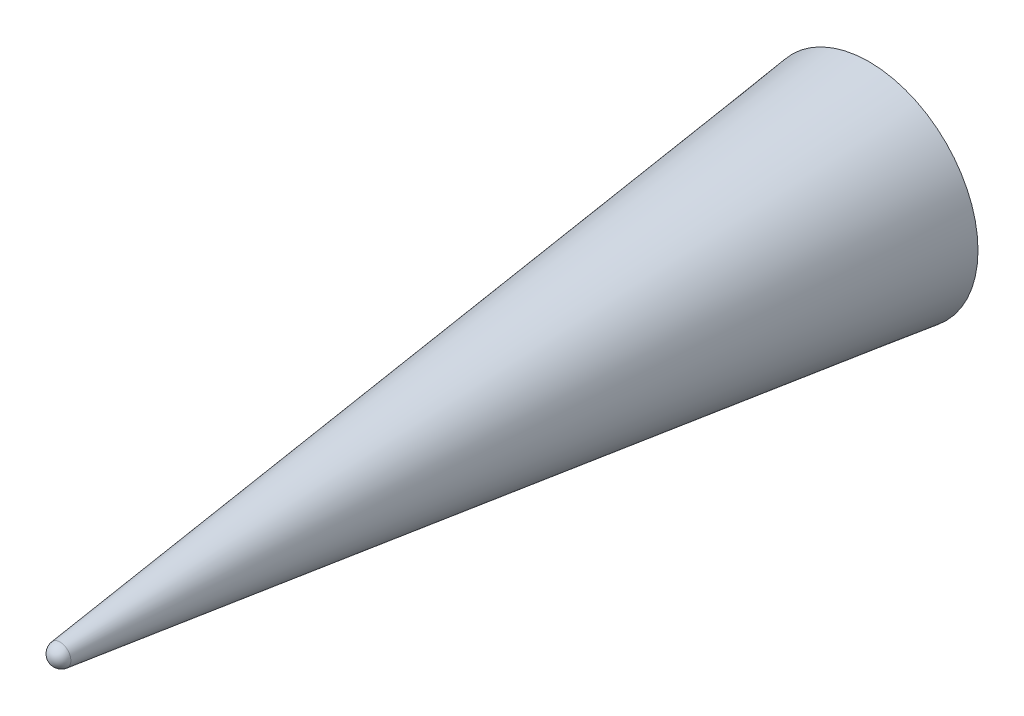
ISO-10303-21;
HEADER;
FILE_DESCRIPTION(('STEP AP214'),'2;1');
FILE_NAME('part.step','',(''),(''),'','','');
FILE_SCHEMA(('AUTOMOTIVE_DESIGN { 1 0 10303 214 1 1 1 1 }'));
ENDSEC;
DATA;
#1=APPLICATION_CONTEXT('core data for automotive mechanical design processes');
#2=APPLICATION_PROTOCOL_DEFINITION('international standard','automotive_design',2000,#1);
#3=PRODUCT_CONTEXT('',#1,'mechanical');
#4=PRODUCT('Part','Part','',(#3));
#5=PRODUCT_RELATED_PRODUCT_CATEGORY('part','',(#4));
#6=PRODUCT_DEFINITION_FORMATION('','',#4);
#7=PRODUCT_DEFINITION_CONTEXT('part definition',#1,'design');
#8=PRODUCT_DEFINITION('design','',#6,#7);
#9=PRODUCT_DEFINITION_SHAPE('','',#8);
#10=(LENGTH_UNIT() NAMED_UNIT(*) SI_UNIT(.MILLI.,.METRE.));
#11=(NAMED_UNIT(*) PLANE_ANGLE_UNIT() SI_UNIT($,.RADIAN.));
#12=(NAMED_UNIT(*) SI_UNIT($,.STERADIAN.) SOLID_ANGLE_UNIT());
#13=UNCERTAINTY_MEASURE_WITH_UNIT(LENGTH_MEASURE(1.E-05),#10,'distance_accuracy_value','');
#14=(GEOMETRIC_REPRESENTATION_CONTEXT(3) GLOBAL_UNCERTAINTY_ASSIGNED_CONTEXT((#13)) GLOBAL_UNIT_ASSIGNED_CONTEXT((#10,
#11,#12)) REPRESENTATION_CONTEXT('',''));
#15=CARTESIAN_POINT('',(0.,0.,0.));
#16=DIRECTION('',(0.,0.,1.));
#17=DIRECTION('',(1.,0.,0.));
#18=AXIS2_PLACEMENT_3D('',#15,#16,#17);
#19=CARTESIAN_POINT('',(0.,0.,0.));
#20=DIRECTION('',(0.,0.,-1.));
#21=DIRECTION('',(-1.,0.,0.));
#22=AXIS2_PLACEMENT_3D('',#19,#20,#21);
#23=CONICAL_SURFACE('',#22,50.8,0.120623668580103);
#24=CARTESIAN_POINT('',(0.,0.,377.494527194967));
#25=DIRECTION('',(0.,0.,1.));
#26=DIRECTION('',(1.,0.,0.));
#27=AXIS2_PLACEMENT_3D('',#24,#25,#26);
#28=CIRCLE('',#27,5.04308761273125);
#29=CARTESIAN_POINT('',(-5.04308761273125,0.,377.494527194967));
#30=VERTEX_POINT('',#29);
#31=EDGE_CURVE('E10',#30,#30,#28,.T.);
#32=CARTESIAN_POINT('',(0.,0.,0.));
#33=DIRECTION('',(0.,0.,1.));
#34=DIRECTION('',(1.,0.,0.));
#35=AXIS2_PLACEMENT_3D('',#32,#33,#34);
#36=CIRCLE('',#35,50.8);
#37=CARTESIAN_POINT('',(-50.8,0.,0.));
#38=VERTEX_POINT('',#37);
#39=EDGE_CURVE('E44',#38,#38,#36,.T.);
#40=CARTESIAN_POINT('',(-5.04308761273125,0.,377.494527194967));
#41=CARTESIAN_POINT('',(-5.5197221167653,0.,373.562292536686));
#42=CARTESIAN_POINT('',(-5.99635662079935,0.,369.630057878405));
#43=CARTESIAN_POINT('',(-6.94962562886745,0.,361.765588561844));
#44=CARTESIAN_POINT('',(-7.4262601329015,0.,357.833353903563));
#45=CARTESIAN_POINT('',(-8.37952914096959,0.,349.968884587001));
#46=CARTESIAN_POINT('',(-8.85616364500365,0.,346.03664992872));
#47=CARTESIAN_POINT('',(-9.80943265307174,0.,338.172180612158));
#48=CARTESIAN_POINT('',(-10.2860671571058,0.,334.239945953877));
#49=CARTESIAN_POINT('',(-11.2393361651739,0.,326.375476637315));
#50=CARTESIAN_POINT('',(-11.7159706692079,0.,322.443241979034));
#51=CARTESIAN_POINT('',(-12.669239677276,0.,314.578772662473));
#52=CARTESIAN_POINT('',(-13.1458741813101,0.,310.646538004192));
#53=CARTESIAN_POINT('',(-14.0991431893782,0.,302.78206868763));
#54=CARTESIAN_POINT('',(-14.5757776934122,0.,298.849834029349));
#55=CARTESIAN_POINT('',(-15.5290467014803,0.,290.985364712787));
#56=CARTESIAN_POINT('',(-16.0056812055144,0.,287.053130054506));
#57=CARTESIAN_POINT('',(-16.9589502135825,0.,279.188660737944));
#58=CARTESIAN_POINT('',(-17.4355847176165,0.,275.256426079664));
#59=CARTESIAN_POINT('',(-18.3888537256846,0.,267.391956763102));
#60=CARTESIAN_POINT('',(-18.8654882297187,0.,263.459722104821));
#61=CARTESIAN_POINT('',(-19.8187572377868,0.,255.595252788259));
#62=CARTESIAN_POINT('',(-20.2953917418208,0.,251.663018129978));
#63=CARTESIAN_POINT('',(-21.2486607498889,0.,243.798548813416));
#64=CARTESIAN_POINT('',(-21.725295253923,0.,239.866314155135));
#65=CARTESIAN_POINT('',(-22.6785642619911,0.,232.001844838574));
#66=CARTESIAN_POINT('',(-23.1551987660251,0.,228.069610180293));
#67=CARTESIAN_POINT('',(-24.1084677740932,0.,220.205140863731));
#68=CARTESIAN_POINT('',(-24.5851022781273,0.,216.27290620545));
#69=CARTESIAN_POINT('',(-25.5383712861954,0.,208.408436888888));
#70=CARTESIAN_POINT('',(-26.0150057902294,0.,204.476202230607));
#71=CARTESIAN_POINT('',(-26.9682747982975,0.,196.611732914045));
#72=CARTESIAN_POINT('',(-27.4449093023316,0.,192.679498255764));
#73=CARTESIAN_POINT('',(-28.3981783103997,0.,184.815028939203));
#74=CARTESIAN_POINT('',(-28.8748128144337,0.,180.882794280922));
#75=CARTESIAN_POINT('',(-29.8280818225018,0.,173.01832496436));
#76=CARTESIAN_POINT('',(-30.3047163265359,0.,169.086090306079));
#77=CARTESIAN_POINT('',(-31.257985334604,0.,161.221620989517));
#78=CARTESIAN_POINT('',(-31.734619838638,0.,157.289386331236));
#79=CARTESIAN_POINT('',(-32.6878888467061,0.,149.424917014674));
#80=CARTESIAN_POINT('',(-33.1645233507402,0.,145.492682356394));
#81=CARTESIAN_POINT('',(-34.1177923588083,0.,137.628213039832));
#82=CARTESIAN_POINT('',(-34.5944268628423,0.,133.695978381551));
#83=CARTESIAN_POINT('',(-35.5476958709104,0.,125.831509064989));
#84=CARTESIAN_POINT('',(-36.0243303749445,0.,121.899274406708));
#85=CARTESIAN_POINT('',(-36.9775993830126,0.,114.034805090146));
#86=CARTESIAN_POINT('',(-37.4542338870466,0.,110.102570431865));
#87=CARTESIAN_POINT('',(-38.4075028951147,0.,102.238101115304));
#88=CARTESIAN_POINT('',(-38.8841373991488,0.,98.3058664570227));
#89=CARTESIAN_POINT('',(-39.8374064072168,0.,90.4413971404609));
#90=CARTESIAN_POINT('',(-40.3140409112509,0.,86.50916248218));
#91=CARTESIAN_POINT('',(-41.267309919319,0.,78.6446931656182));
#92=CARTESIAN_POINT('',(-41.743944423353,0.,74.7124585073373));
#93=CARTESIAN_POINT('',(-42.6972134314211,0.,66.8479891907755));
#94=CARTESIAN_POINT('',(-43.1738479354552,0.,62.9157545324945));
#95=CARTESIAN_POINT('',(-44.1271169435233,0.,55.0512852159327));
#96=CARTESIAN_POINT('',(-44.6037514475574,0.,51.1190505576518));
#97=CARTESIAN_POINT('',(-45.5570204556254,0.,43.25458124109));
#98=CARTESIAN_POINT('',(-46.0336549596595,0.,39.3223465828091));
#99=CARTESIAN_POINT('',(-46.9869239677276,0.,31.4578772662473));
#100=CARTESIAN_POINT('',(-47.4635584717616,0.,27.5256426079664));
#101=CARTESIAN_POINT('',(-48.4168274798297,0.,19.6611732914045));
#102=CARTESIAN_POINT('',(-48.8934619838638,0.,15.7289386331236));
#103=CARTESIAN_POINT('',(-49.8467309919319,0.,7.86446931656182));
#104=CARTESIAN_POINT('',(-50.3233654959659,0.,3.93223465828091));
#105=CARTESIAN_POINT('',(-50.8,0.,0.));
#106=B_SPLINE_CURVE_WITH_KNOTS('',3,(#40,#41,#42,#43,#44,#45,#46,#47,#48,#49,#50,#51,#52,#53,
#54,#55,#56,#57,#58,#59,#60,#61,#62,#63,#64,#65,#66,#67,#68,#69,#70,#71,#72,#73,#74,#75,#76,#77,
#78,#79,#80,#81,#82,#83,#84,#85,#86,#87,#88,#89,#90,#91,#92,#93,#94,#95,#96,#97,#98,#99,#100,
#101,#102,#103,#104,#105),.UNSPECIFIED.,.F.,.F.,(4,2,2,2,2,2,2,2,2,2,2,2,2,2,2,2,2,2,2,2,2,2,2,
2,2,2,2,2,2,2,2,2,4),(0.,11.8830487975095,23.766097595019,35.6491463925285,47.532195190038,
59.4152439875476,71.2982927850571,83.1813415825665,95.0643903800761,106.947439177586,
118.830487975095,130.713536772605,142.596585570114,154.479634367624,166.362683165133,
178.245731962643,190.128780760152,202.011829557662,213.894878355171,225.777927152681,
237.66097595019,249.5440247477,261.427073545209,273.310122342719,285.193171140228,
297.076219937738,308.959268735247,320.842317532757,332.725366330266,344.608415127776,
356.491463925285,368.374512722795,380.257561520304),.UNSPECIFIED.);
#107=EDGE_CURVE('BSEAM38',#30,#38,#106,.T.);
#108=ORIENTED_EDGE('',*,*,#31,.F.);
#109=ORIENTED_EDGE('',*,*,#39,.T.);
#110=ORIENTED_EDGE('',*,*,#107,.T.);
#111=ORIENTED_EDGE('',*,*,#107,.F.);
#112=EDGE_LOOP('',(#108,#110,#109,#111));
#113=FACE_BOUND('',#112,.T.);
#114=ADVANCED_FACE('F38',(#113),#23,.T.);
#115=CARTESIAN_POINT('',(0.,0.,376.883243847969));
#116=DIRECTION('',(0.,0.,1.));
#117=DIRECTION('',(0.,1.,0.));
#118=AXIS2_PLACEMENT_3D('',#115,#116,#117);
#119=SPHERICAL_SURFACE('',#118,5.08000000000002);
#120=ORIENTED_EDGE('',*,*,#31,.T.);
#121=EDGE_LOOP('',(#120));
#122=FACE_BOUND('',#121,.T.);
#123=ADVANCED_FACE('F53',(#122),#119,.T.);
#124=CARTESIAN_POINT('',(0.,50.8,0.));
#125=DIRECTION('',(0.,0.,1.));
#126=DIRECTION('',(1.,0.,0.));
#127=AXIS2_PLACEMENT_3D('',#124,#125,#126);
#128=PLANE('',#127);
#129=ORIENTED_EDGE('',*,*,#39,.F.);
#130=EDGE_LOOP('',(#129));
#131=FACE_BOUND('',#130,.T.);
#132=ADVANCED_FACE('F51',(#131),#128,.F.);
#133=CLOSED_SHELL('',(#114,#123,#132));
#134=MANIFOLD_SOLID_BREP('B2',#133);
#135=ADVANCED_BREP_SHAPE_REPRESENTATION('',(#18,#134),#14);
#136=SHAPE_DEFINITION_REPRESENTATION(#9,#135);
ENDSEC;
END-ISO-10303-21;
